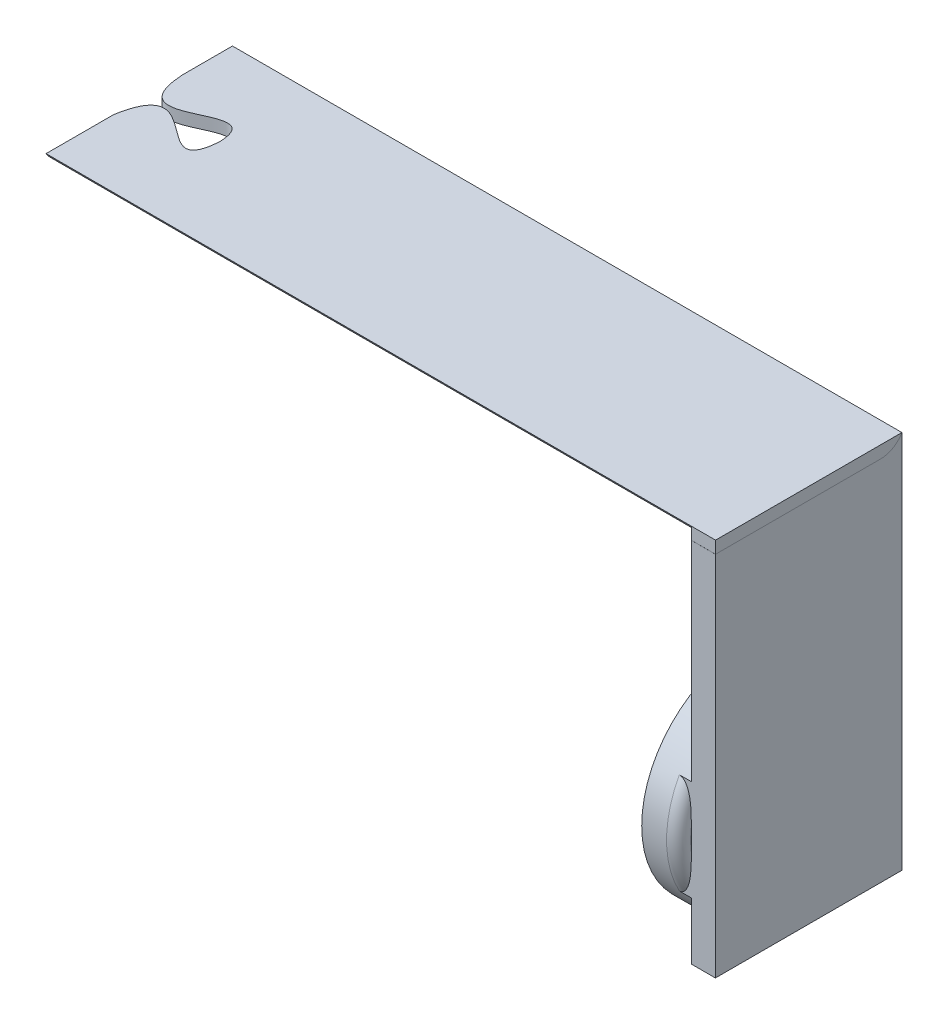
ISO-10303-21;
HEADER;
FILE_DESCRIPTION(('STEP AP214'),'2;1');
FILE_NAME('part.step','',(''),(''),'','','');
FILE_SCHEMA(('AUTOMOTIVE_DESIGN { 1 0 10303 214 1 1 1 1 }'));
ENDSEC;
DATA;
#1=APPLICATION_CONTEXT('core data for automotive mechanical design processes');
#2=APPLICATION_PROTOCOL_DEFINITION('international standard','automotive_design',2000,#1);
#3=PRODUCT_CONTEXT('',#1,'mechanical');
#4=PRODUCT('Part','Part','',(#3));
#5=PRODUCT_RELATED_PRODUCT_CATEGORY('part','',(#4));
#6=PRODUCT_DEFINITION_FORMATION('','',#4);
#7=PRODUCT_DEFINITION_CONTEXT('part definition',#1,'design');
#8=PRODUCT_DEFINITION('design','',#6,#7);
#9=PRODUCT_DEFINITION_SHAPE('','',#8);
#10=(LENGTH_UNIT() NAMED_UNIT(*) SI_UNIT(.MILLI.,.METRE.));
#11=(NAMED_UNIT(*) PLANE_ANGLE_UNIT() SI_UNIT($,.RADIAN.));
#12=(NAMED_UNIT(*) SI_UNIT($,.STERADIAN.) SOLID_ANGLE_UNIT());
#13=UNCERTAINTY_MEASURE_WITH_UNIT(LENGTH_MEASURE(1.E-05),#10,'distance_accuracy_value','');
#14=(GEOMETRIC_REPRESENTATION_CONTEXT(3) GLOBAL_UNCERTAINTY_ASSIGNED_CONTEXT((#13)) GLOBAL_UNIT_ASSIGNED_CONTEXT((#10,
#11,#12)) REPRESENTATION_CONTEXT('',''));
#15=CARTESIAN_POINT('',(0.,0.,0.));
#16=DIRECTION('',(0.,0.,1.));
#17=DIRECTION('',(1.,0.,0.));
#18=AXIS2_PLACEMENT_3D('',#15,#16,#17);
#19=CARTESIAN_POINT('',(8.64923186763945,0.,-18.2354736055888));
#20=DIRECTION('',(0.,1.,0.));
#21=DIRECTION('',(0.,0.,1.));
#22=AXIS2_PLACEMENT_3D('',#19,#20,#21);
#23=PLANE('',#22);
#24=DIRECTION('',(0.,0.,-1.));
#25=VECTOR('',#24,1.);
#26=CARTESIAN_POINT('',(133.981908671217,0.,-38.6842824654206));
#27=LINE('',#26,#25);
#28=CARTESIAN_POINT('',(133.981908671217,0.,-4.39940905122496));
#29=VERTEX_POINT('',#28);
#30=CARTESIAN_POINT('',(133.981908671217,0.,-34.2955617878023));
#31=VERTEX_POINT('',#30);
#32=EDGE_CURVE('E399',#29,#31,#27,.T.);
#33=ORIENTED_EDGE('',*,*,#32,.F.);
#34=DIRECTION('',(1.,0.,0.));
#35=VECTOR('',#34,1.);
#36=CARTESIAN_POINT('',(8.64923186763945,0.,-4.39940905122495));
#37=LINE('',#36,#35);
#38=CARTESIAN_POINT('',(0.,0.,-4.39940905122495));
#39=VERTEX_POINT('',#38);
#40=EDGE_CURVE('E48',#29,#39,#37,.F.);
#41=ORIENTED_EDGE('',*,*,#40,.T.);
#42=DIRECTION('',(0.,0.,1.));
#43=VECTOR('',#42,1.);
#44=CARTESIAN_POINT('',(0.,0.,0.));
#45=LINE('',#44,#43);
#46=CARTESIAN_POINT('',(0.,0.,-14.045240588338));
#47=VERTEX_POINT('',#46);
#48=EDGE_CURVE('E208',#47,#39,#45,.T.);
#49=ORIENTED_EDGE('',*,*,#48,.F.);
#50=CARTESIAN_POINT('',(15.8765522946349,0.,-19.9365647930575));
#51=CARTESIAN_POINT('',(14.6824579665654,0.,-5.67764296523862));
#52=CARTESIAN_POINT('',(3.08997624892814,0.,-31.6230181891996));
#53=CARTESIAN_POINT('',(0.,0.,-14.045240588338));
#54=B_SPLINE_CURVE_WITH_KNOTS('',3,(#50,#51,#52,#53),.UNSPECIFIED.,.F.,.F.,(4,4),(0.,1.),.UNSPECIFIED.);
#55=CARTESIAN_POINT('',(15.8765522946349,0.,-19.9365647930574));
#56=VERTEX_POINT('',#55);
#57=EDGE_CURVE('E213',#56,#47,#54,.T.);
#58=ORIENTED_EDGE('',*,*,#57,.F.);
#59=CARTESIAN_POINT('',(0.,0.,-28.2938483763786));
#60=CARTESIAN_POINT('',(1.00330627640816,0.,-11.158784678883));
#61=CARTESIAN_POINT('',(15.6582135386403,0.,-32.998799430672));
#62=CARTESIAN_POINT('',(15.8765522946349,0.,-19.9365647930574));
#63=B_SPLINE_CURVE_WITH_KNOTS('',3,(#59,#60,#61,#62),.UNSPECIFIED.,.F.,.F.,(4,4),(0.,1.),.UNSPECIFIED.);
#64=CARTESIAN_POINT('',(0.,0.,-28.2938483763786));
#65=VERTEX_POINT('',#64);
#66=EDGE_CURVE('E371',#65,#56,#63,.T.);
#67=ORIENTED_EDGE('',*,*,#66,.F.);
#68=DIRECTION('',(0.,0.,1.));
#69=VECTOR('',#68,1.);
#70=CARTESIAN_POINT('',(0.,0.,-28.2938483763786));
#71=LINE('',#70,#69);
#72=CARTESIAN_POINT('',(0.,0.,-34.2955617878023));
#73=VERTEX_POINT('',#72);
#74=EDGE_CURVE('E367',#73,#65,#71,.T.);
#75=ORIENTED_EDGE('',*,*,#74,.F.);
#76=DIRECTION('',(-1.,0.,0.));
#77=VECTOR('',#76,1.);
#78=CARTESIAN_POINT('',(8.64923186763945,0.,-34.2955617878023));
#79=LINE('',#78,#77);
#80=EDGE_CURVE('E326',#73,#31,#79,.F.);
#81=ORIENTED_EDGE('',*,*,#80,.T.);
#82=EDGE_LOOP('',(#33,#41,#49,#58,#67,#75,#81));
#83=FACE_BOUND('',#82,.T.);
#84=ADVANCED_FACE('F33',(#83),#23,.F.);
#85=CARTESIAN_POINT('',(133.981908671217,-76.2,-38.6842824654206));
#86=DIRECTION('',(1.,0.,0.));
#87=DIRECTION('',(0.,0.,-1.));
#88=AXIS2_PLACEMENT_3D('',#85,#86,#87);
#89=PLANE('',#88);
#90=CARTESIAN_POINT('',(133.981908671217,-53.848,-19.3474854195136));
#91=DIRECTION('',(-1.,0.,0.));
#92=DIRECTION('',(0.,0.,1.));
#93=AXIS2_PLACEMENT_3D('',#90,#91,#92);
#94=CIRCLE('',#93,22.);
#95=CARTESIAN_POINT('',(133.981908671217,-64.3402962217716,-38.6842824654206));
#96=VERTEX_POINT('',#95);
#97=CARTESIAN_POINT('',(133.981908671217,-64.3008038054558,0.01068837360663));
#98=VERTEX_POINT('',#97);
#99=EDGE_CURVE('E190',#96,#98,#94,.T.);
#100=ORIENTED_EDGE('',*,*,#99,.F.);
#101=DIRECTION('',(0.,1.,0.));
#102=VECTOR('',#101,1.);
#103=CARTESIAN_POINT('',(133.981908671217,-76.2,-38.6842824654206));
#104=LINE('',#103,#102);
#105=CARTESIAN_POINT('',(133.981908671217,-76.2,-38.6842824654206));
#106=VERTEX_POINT('',#105);
#107=EDGE_CURVE('E198',#106,#96,#104,.T.);
#108=ORIENTED_EDGE('',*,*,#107,.F.);
#109=DIRECTION('',(0.,0.,-1.));
#110=VECTOR('',#109,1.);
#111=CARTESIAN_POINT('',(133.981908671217,-76.2,-38.6842824654206));
#112=LINE('',#111,#110);
#113=CARTESIAN_POINT('',(133.981908671217,-76.2,0.0106883736066284));
#114=VERTEX_POINT('',#113);
#115=EDGE_CURVE('E429',#114,#106,#112,.T.);
#116=ORIENTED_EDGE('',*,*,#115,.F.);
#117=DIRECTION('',(0.,1.,0.));
#118=VECTOR('',#117,1.);
#119=CARTESIAN_POINT('',(133.981908671217,-76.2,0.0106883736066284));
#120=LINE('',#119,#118);
#121=EDGE_CURVE('E197',#114,#98,#120,.T.);
#122=ORIENTED_EDGE('',*,*,#121,.T.);
#123=EDGE_LOOP('',(#100,#108,#116,#122));
#124=FACE_BOUND('',#123,.T.);
#125=ADVANCED_FACE('F300',(#124),#89,.F.);
#126=DIRECTION('',(0.,0.,1.));
#127=VECTOR('',#126,1.);
#128=CARTESIAN_POINT('',(138.981908671217,0.,-38.6842824654206));
#129=LINE('',#128,#127);
#130=CARTESIAN_POINT('',(138.981908671217,0.,-34.2955617878023));
#131=VERTEX_POINT('',#130);
#132=CARTESIAN_POINT('',(138.981908671217,0.,0.));
#133=VERTEX_POINT('',#132);
#134=EDGE_CURVE('E435',#131,#133,#129,.T.);
#135=ORIENTED_EDGE('',*,*,#134,.F.);
#136=DIRECTION('',(-1.,0.,0.));
#137=VECTOR('',#136,1.);
#138=CARTESIAN_POINT('',(8.64923186763945,0.,-34.2955617878023));
#139=LINE('',#138,#137);
#140=CARTESIAN_POINT('',(139.,0.,-34.2955617878023));
#141=VERTEX_POINT('',#140);
#142=EDGE_CURVE('E324',#131,#141,#139,.F.);
#143=ORIENTED_EDGE('',*,*,#142,.T.);
#144=DIRECTION('',(0.,0.,-1.));
#145=VECTOR('',#144,1.);
#146=CARTESIAN_POINT('',(139.,0.,0.));
#147=LINE('',#146,#145);
#148=CARTESIAN_POINT('',(139.,0.,0.));
#149=VERTEX_POINT('',#148);
#150=EDGE_CURVE('E372',#149,#141,#147,.T.);
#151=ORIENTED_EDGE('',*,*,#150,.F.);
#152=DIRECTION('',(1.,0.,0.));
#153=VECTOR('',#152,1.);
#154=CARTESIAN_POINT('',(0.,0.,0.));
#155=LINE('',#154,#153);
#156=EDGE_CURVE('E448',#133,#149,#155,.T.);
#157=ORIENTED_EDGE('',*,*,#156,.F.);
#158=EDGE_LOOP('',(#135,#143,#151,#157));
#159=FACE_BOUND('',#158,.T.);
#160=ADVANCED_FACE('F261',(#159),#23,.F.);
#161=CARTESIAN_POINT('',(0.,2.54,0.));
#162=DIRECTION('',(1.,0.,0.));
#163=DIRECTION('',(0.,0.,-1.));
#164=AXIS2_PLACEMENT_3D('',#161,#162,#163);
#165=PLANE('',#164);
#166=ORIENTED_EDGE('',*,*,#48,.T.);
#167=CARTESIAN_POINT('',(0.,5.08,-4.39940905122495));
#168=DIRECTION('',(1.,0.,0.));
#169=DIRECTION('',(0.,0.,-1.));
#170=AXIS2_PLACEMENT_3D('',#167,#168,#169);
#171=CIRCLE('',#170,5.08);
#172=CARTESIAN_POINT('',(0.,2.54,0.));
#173=VERTEX_POINT('',#172);
#174=EDGE_CURVE('E41',#39,#173,#171,.F.);
#175=ORIENTED_EDGE('',*,*,#174,.T.);
#176=DIRECTION('',(0.,0.,1.));
#177=VECTOR('',#176,1.);
#178=CARTESIAN_POINT('',(0.,2.54,0.));
#179=LINE('',#178,#177);
#180=CARTESIAN_POINT('',(0.,2.54,-14.045240588338));
#181=VERTEX_POINT('',#180);
#182=EDGE_CURVE('E209',#181,#173,#179,.T.);
#183=ORIENTED_EDGE('',*,*,#182,.F.);
#184=DIRECTION('',(0.,-1.,0.));
#185=VECTOR('',#184,1.);
#186=CARTESIAN_POINT('',(0.,2.54,-14.045240588338));
#187=LINE('',#186,#185);
#188=EDGE_CURVE('E388',#181,#47,#187,.T.);
#189=ORIENTED_EDGE('',*,*,#188,.T.);
#190=EDGE_LOOP('',(#166,#175,#183,#189));
#191=FACE_BOUND('',#190,.T.);
#192=ADVANCED_FACE('F257',(#191),#165,.F.);
#193=CARTESIAN_POINT('',(0.,2.54,0.));
#194=DIRECTION('',(0.,0.,-1.));
#195=DIRECTION('',(-1.,0.,0.));
#196=AXIS2_PLACEMENT_3D('',#193,#194,#195);
#197=PLANE('',#196);
#198=DIRECTION('',(1.,0.,0.));
#199=VECTOR('',#198,1.);
#200=CARTESIAN_POINT('',(0.,2.54,0.));
#201=LINE('',#200,#199);
#202=CARTESIAN_POINT('',(133.981908671217,2.54,0.));
#203=VERTEX_POINT('',#202);
#204=CARTESIAN_POINT('',(139.,2.54,0.));
#205=VERTEX_POINT('',#204);
#206=EDGE_CURVE('E212',#203,#205,#201,.T.);
#207=ORIENTED_EDGE('',*,*,#206,.F.);
#208=DIRECTION('',(0.,-1.,0.));
#209=VECTOR('',#208,1.);
#210=CARTESIAN_POINT('',(133.981908671217,2.54,0.));
#211=LINE('',#210,#209);
#212=CARTESIAN_POINT('',(133.981908671217,0.,0.));
#213=VERTEX_POINT('',#212);
#214=EDGE_CURVE('E338',#203,#213,#211,.T.);
#215=ORIENTED_EDGE('',*,*,#214,.T.);
#216=EDGE_CURVE('E376',#213,#133,#155,.T.);
#217=ORIENTED_EDGE('',*,*,#216,.T.);
#218=ORIENTED_EDGE('',*,*,#156,.T.);
#219=DIRECTION('',(0.,-1.,0.));
#220=VECTOR('',#219,1.);
#221=CARTESIAN_POINT('',(139.,2.54,0.));
#222=LINE('',#221,#220);
#223=EDGE_CURVE('E355',#205,#149,#222,.T.);
#224=ORIENTED_EDGE('',*,*,#223,.F.);
#225=EDGE_LOOP('',(#207,#215,#217,#218,#224));
#226=FACE_BOUND('',#225,.T.);
#227=ADVANCED_FACE('F253',(#226),#197,.F.);
#228=CARTESIAN_POINT('',(139.,2.54,0.));
#229=DIRECTION('',(-1.,0.,0.));
#230=DIRECTION('',(0.,0.,1.));
#231=AXIS2_PLACEMENT_3D('',#228,#229,#230);
#232=PLANE('',#231);
#233=ORIENTED_EDGE('',*,*,#150,.T.);
#234=CARTESIAN_POINT('',(139.,5.08,-34.2955617878023));
#235=DIRECTION('',(-1.,0.,0.));
#236=DIRECTION('',(0.,0.,1.));
#237=AXIS2_PLACEMENT_3D('',#234,#235,#236);
#238=CIRCLE('',#237,5.08);
#239=CARTESIAN_POINT('',(139.,2.54,-38.6949708390272));
#240=VERTEX_POINT('',#239);
#241=EDGE_CURVE('E329',#141,#240,#238,.F.);
#242=ORIENTED_EDGE('',*,*,#241,.T.);
#243=DIRECTION('',(0.,0.,-1.));
#244=VECTOR('',#243,1.);
#245=CARTESIAN_POINT('',(139.,2.54,0.));
#246=LINE('',#245,#244);
#247=EDGE_CURVE('E217',#205,#240,#246,.T.);
#248=ORIENTED_EDGE('',*,*,#247,.F.);
#249=ORIENTED_EDGE('',*,*,#223,.T.);
#250=EDGE_LOOP('',(#233,#242,#248,#249));
#251=FACE_BOUND('',#250,.T.);
#252=ADVANCED_FACE('F249',(#251),#232,.F.);
#253=CARTESIAN_POINT('',(0.,2.54,-28.2938483763786));
#254=DIRECTION('',(1.,0.,0.));
#255=DIRECTION('',(0.,0.,-1.));
#256=AXIS2_PLACEMENT_3D('',#253,#254,#255);
#257=PLANE('',#256);
#258=DIRECTION('',(0.,0.,1.));
#259=VECTOR('',#258,1.);
#260=CARTESIAN_POINT('',(0.,2.54,-28.2938483763786));
#261=LINE('',#260,#259);
#262=CARTESIAN_POINT('',(0.,2.54,-38.6949708390272));
#263=VERTEX_POINT('',#262);
#264=CARTESIAN_POINT('',(0.,2.54,-28.2938483763786));
#265=VERTEX_POINT('',#264);
#266=EDGE_CURVE('E223',#263,#265,#261,.T.);
#267=ORIENTED_EDGE('',*,*,#266,.F.);
#268=CARTESIAN_POINT('',(0.,5.08,-34.2955617878023));
#269=DIRECTION('',(1.,0.,0.));
#270=DIRECTION('',(0.,0.,-1.));
#271=AXIS2_PLACEMENT_3D('',#268,#269,#270);
#272=CIRCLE('',#271,5.08);
#273=EDGE_CURVE('E322',#263,#73,#272,.F.);
#274=ORIENTED_EDGE('',*,*,#273,.T.);
#275=ORIENTED_EDGE('',*,*,#74,.T.);
#276=DIRECTION('',(0.,-1.,0.));
#277=VECTOR('',#276,1.);
#278=CARTESIAN_POINT('',(0.,2.54,-28.2938483763786));
#279=LINE('',#278,#277);
#280=EDGE_CURVE('E396',#265,#65,#279,.T.);
#281=ORIENTED_EDGE('',*,*,#280,.F.);
#282=EDGE_LOOP('',(#267,#274,#275,#281));
#283=FACE_BOUND('',#282,.T.);
#284=ADVANCED_FACE('F244',(#283),#257,.F.);
#285=CARTESIAN_POINT('',(0.,2.54,-28.2938483763786));
#286=CARTESIAN_POINT('',(1.00330627640816,2.54,-11.158784678883));
#287=CARTESIAN_POINT('',(15.6582135386403,2.54,-32.998799430672));
#288=CARTESIAN_POINT('',(15.8765522946349,2.54,-19.9365647930574));
#289=B_SPLINE_CURVE_WITH_KNOTS('',3,(#285,#286,#287,#288),.UNSPECIFIED.,.F.,.F.,(4,4),(0.,1.),.UNSPECIFIED.);
#290=DIRECTION('',(0.,-1.,0.));
#291=VECTOR('',#290,1.);
#292=SURFACE_OF_LINEAR_EXTRUSION('',#289,#291);
#293=ORIENTED_EDGE('',*,*,#66,.T.);
#294=DIRECTION('',(0.,-1.,0.));
#295=VECTOR('',#294,1.);
#296=CARTESIAN_POINT('',(15.8765522946349,2.54,-19.9365647930574));
#297=LINE('',#296,#295);
#298=CARTESIAN_POINT('',(15.8765522946349,2.54,-19.9365647930574));
#299=VERTEX_POINT('',#298);
#300=EDGE_CURVE('E393',#299,#56,#297,.T.);
#301=ORIENTED_EDGE('',*,*,#300,.F.);
#302=EDGE_CURVE('E225',#265,#299,#289,.T.);
#303=ORIENTED_EDGE('',*,*,#302,.F.);
#304=ORIENTED_EDGE('',*,*,#280,.T.);
#305=EDGE_LOOP('',(#293,#301,#303,#304));
#306=FACE_BOUND('',#305,.T.);
#307=ADVANCED_FACE('F239',(#306),#292,.F.);
#308=CARTESIAN_POINT('',(15.8765522946349,2.54,-19.9365647930575));
#309=CARTESIAN_POINT('',(14.6824579665654,2.54,-5.67764296523862));
#310=CARTESIAN_POINT('',(3.08997624892814,2.54,-31.6230181891996));
#311=CARTESIAN_POINT('',(0.,2.54,-14.045240588338));
#312=B_SPLINE_CURVE_WITH_KNOTS('',3,(#308,#309,#310,#311),.UNSPECIFIED.,.F.,.F.,(4,4),(0.,1.),.UNSPECIFIED.);
#313=DIRECTION('',(0.,-1.,0.));
#314=VECTOR('',#313,1.);
#315=SURFACE_OF_LINEAR_EXTRUSION('',#312,#314);
#316=ORIENTED_EDGE('',*,*,#57,.T.);
#317=ORIENTED_EDGE('',*,*,#188,.F.);
#318=EDGE_CURVE('E230',#299,#181,#312,.T.);
#319=ORIENTED_EDGE('',*,*,#318,.F.);
#320=ORIENTED_EDGE('',*,*,#300,.T.);
#321=EDGE_LOOP('',(#316,#317,#319,#320));
#322=FACE_BOUND('',#321,.T.);
#323=ADVANCED_FACE('F243',(#322),#315,.F.);
#324=CARTESIAN_POINT('',(8.64923186763945,2.54,-18.2354736055888));
#325=DIRECTION('',(0.,1.,0.));
#326=DIRECTION('',(0.,0.,1.));
#327=AXIS2_PLACEMENT_3D('',#324,#325,#326);
#328=PLANE('',#327);
#329=ORIENTED_EDGE('',*,*,#182,.T.);
#330=EDGE_CURVE('E214',#173,#203,#201,.T.);
#331=ORIENTED_EDGE('',*,*,#330,.T.);
#332=ORIENTED_EDGE('',*,*,#206,.T.);
#333=ORIENTED_EDGE('',*,*,#247,.T.);
#334=DIRECTION('',(-1.,0.,0.));
#335=VECTOR('',#334,1.);
#336=CARTESIAN_POINT('',(0.,2.54,-38.6949708390272));
#337=LINE('',#336,#335);
#338=EDGE_CURVE('E220',#240,#263,#337,.T.);
#339=ORIENTED_EDGE('',*,*,#338,.T.);
#340=ORIENTED_EDGE('',*,*,#266,.T.);
#341=ORIENTED_EDGE('',*,*,#302,.T.);
#342=ORIENTED_EDGE('',*,*,#318,.T.);
#343=EDGE_LOOP('',(#329,#331,#332,#333,#339,#340,#341,#342));
#344=FACE_BOUND('',#343,.T.);
#345=ADVANCED_FACE('F346',(#344),#328,.T.);
#346=CARTESIAN_POINT('',(138.981908671217,-76.2,-38.6842824654206));
#347=DIRECTION('',(-1.,0.,0.));
#348=DIRECTION('',(0.,0.,1.));
#349=AXIS2_PLACEMENT_3D('',#346,#347,#348);
#350=PLANE('',#349);
#351=DIRECTION('',(0.,1.,0.));
#352=VECTOR('',#351,1.);
#353=CARTESIAN_POINT('',(138.981908671217,-76.2,-38.6842824654206));
#354=LINE('',#353,#352);
#355=CARTESIAN_POINT('',(138.981908671217,-76.2,-38.6842824654206));
#356=VERTEX_POINT('',#355);
#357=CARTESIAN_POINT('',(138.981908671217,2.52157649834013,-38.6842824654206));
#358=VERTEX_POINT('',#357);
#359=EDGE_CURVE('E425',#356,#358,#354,.T.);
#360=ORIENTED_EDGE('',*,*,#359,.T.);
#361=CARTESIAN_POINT('',(138.981908671217,5.08,-34.2955617878023));
#362=DIRECTION('',(-1.,0.,0.));
#363=DIRECTION('',(0.,0.,1.));
#364=AXIS2_PLACEMENT_3D('',#361,#362,#363);
#365=CIRCLE('',#364,5.08);
#366=EDGE_CURVE('E336',#358,#131,#365,.T.);
#367=ORIENTED_EDGE('',*,*,#366,.T.);
#368=ORIENTED_EDGE('',*,*,#134,.T.);
#369=CARTESIAN_POINT('',(138.981908671217,0.,0.010688373606629));
#370=VERTEX_POINT('',#369);
#371=EDGE_CURVE('E437',#133,#370,#129,.T.);
#372=ORIENTED_EDGE('',*,*,#371,.T.);
#373=DIRECTION('',(0.,1.,0.));
#374=VECTOR('',#373,1.);
#375=CARTESIAN_POINT('',(138.981908671217,-76.2,0.010688373606629));
#376=LINE('',#375,#374);
#377=CARTESIAN_POINT('',(138.981908671217,-76.2,0.010688373606629));
#378=VERTEX_POINT('',#377);
#379=EDGE_CURVE('E201',#378,#370,#376,.T.);
#380=ORIENTED_EDGE('',*,*,#379,.F.);
#381=DIRECTION('',(0.,0.,1.));
#382=VECTOR('',#381,1.);
#383=CARTESIAN_POINT('',(138.981908671217,-76.2,-38.6842824654206));
#384=LINE('',#383,#382);
#385=EDGE_CURVE('E439',#356,#378,#384,.T.);
#386=ORIENTED_EDGE('',*,*,#385,.F.);
#387=EDGE_LOOP('',(#360,#367,#368,#372,#380,#386));
#388=FACE_BOUND('',#387,.T.);
#389=ADVANCED_FACE('F304',(#388),#350,.F.);
#390=CARTESIAN_POINT('',(138.981908671217,-76.2,0.010688373606629));
#391=DIRECTION('',(0.,0.,-1.));
#392=DIRECTION('',(-1.,0.,0.));
#393=AXIS2_PLACEMENT_3D('',#390,#391,#392);
#394=PLANE('',#393);
#395=DIRECTION('',(-1.,0.,0.));
#396=VECTOR('',#395,1.);
#397=CARTESIAN_POINT('',(138.981908671217,0.,0.010688373606629));
#398=LINE('',#397,#396);
#399=CARTESIAN_POINT('',(133.981908671217,0.,0.0106883736066284));
#400=VERTEX_POINT('',#399);
#401=EDGE_CURVE('E195',#370,#400,#398,.T.);
#402=ORIENTED_EDGE('',*,*,#401,.T.);
#403=CARTESIAN_POINT('',(133.981908671217,-43.3951961945441,0.01068837360663));
#404=VERTEX_POINT('',#403);
#405=EDGE_CURVE('E185',#404,#400,#120,.T.);
#406=ORIENTED_EDGE('',*,*,#405,.F.);
#407=DIRECTION('',(1.,0.,0.));
#408=VECTOR('',#407,1.);
#409=CARTESIAN_POINT('',(131.481908671217,-43.3951961945441,0.0106883736066281));
#410=LINE('',#409,#408);
#411=CARTESIAN_POINT('',(131.481908671217,-43.3951961945441,0.0106883736066281));
#412=VERTEX_POINT('',#411);
#413=EDGE_CURVE('E170',#412,#404,#410,.T.);
#414=ORIENTED_EDGE('',*,*,#413,.F.);
#415=CARTESIAN_POINT('',(131.481908671217,-43.3951961945441,0.0106883736066281));
#416=CARTESIAN_POINT('',(131.517720355948,-43.395188155444,0.0106883736066281));
#417=CARTESIAN_POINT('',(131.553511819631,-43.3968171069313,0.0106883736066281));
#418=CARTESIAN_POINT('',(131.624777186174,-43.4032626875032,0.0106883736066281));
#419=CARTESIAN_POINT('',(131.660251330287,-43.4080766408066,0.0106883736066281));
#420=CARTESIAN_POINT('',(131.765198343257,-43.4270489773248,0.0106883736066281));
#421=CARTESIAN_POINT('',(131.833890942065,-43.4457415019394,0.0106883736066281));
#422=CARTESIAN_POINT('',(131.967155095708,-43.4936407228407,0.0106883736066281));
#423=CARTESIAN_POINT('',(132.031738533081,-43.5228153137316,0.0106883736066282));
#424=CARTESIAN_POINT('',(132.156352793604,-43.5898445892212,0.0106883736066282));
#425=CARTESIAN_POINT('',(132.216372243573,-43.6277200695228,0.0106883736066282));
#426=CARTESIAN_POINT('',(132.371614104055,-43.7391249722142,0.0106883736066282));
#427=CARTESIAN_POINT('',(132.462199505101,-43.8190994637775,0.0106883736066282));
#428=CARTESIAN_POINT('',(132.630084110199,-43.9919212519078,0.0106883736066282));
#429=CARTESIAN_POINT('',(132.707345561836,-44.0848038219689,0.0106883736066282));
#430=CARTESIAN_POINT('',(132.842390140228,-44.2682522511272,0.0106883736066282));
#431=CARTESIAN_POINT('',(132.901381582368,-44.3579449218048,0.0106883736066283));
#432=CARTESIAN_POINT('',(133.011493142527,-44.5420855737969,0.0106883736066283));
#433=CARTESIAN_POINT('',(133.062606576622,-44.6365375038384,0.0106883736066283));
#434=CARTESIAN_POINT('',(133.158091931585,-44.8289505188739,0.0106883736066283));
#435=CARTESIAN_POINT('',(133.202452429907,-44.9269172107501,0.0106883736066283));
#436=CARTESIAN_POINT('',(133.285243201985,-45.1252593119089,0.0106883736066283));
#437=CARTESIAN_POINT('',(133.323675553314,-45.2256338630199,0.0106883736066283));
#438=CARTESIAN_POINT('',(133.411139046982,-45.4725794741439,0.0106883736066283));
#439=CARTESIAN_POINT('',(133.457433369633,-45.6201173589704,0.0106883736066283));
#440=CARTESIAN_POINT('',(133.541302952854,-45.9176787026414,0.0106883736066283));
#441=CARTESIAN_POINT('',(133.578873862368,-46.06770336204,0.0106883736066283));
#442=CARTESIAN_POINT('',(133.646796969584,-46.3696312293421,0.0106883736066283));
#443=CARTESIAN_POINT('',(133.677136574026,-46.5215372367276,0.0106883736066284));
#444=CARTESIAN_POINT('',(133.73171111904,-46.8264543647306,0.0106883736066284));
#445=CARTESIAN_POINT('',(133.7559449284,-46.9794656847342,0.0106883736066284));
#446=CARTESIAN_POINT('',(133.799416467178,-47.2871105725718,0.0106883736066284));
#447=CARTESIAN_POINT('',(133.818623777572,-47.4417483818706,0.0106883736066284));
#448=CARTESIAN_POINT('',(133.85269487994,-47.7515064266056,0.0106883736066284));
#449=CARTESIAN_POINT('',(133.867558281744,-47.9066267041135,0.0106883736066284));
#450=CARTESIAN_POINT('',(133.906749890725,-48.3725063331307,0.0106883736066284));
#451=CARTESIAN_POINT('',(133.925671330688,-48.6837221302626,0.0106883736066284));
#452=CARTESIAN_POINT('',(133.944498611049,-49.1001788378973,0.0106883736066284));
#453=CARTESIAN_POINT('',(133.94869711845,-49.2052689168414,0.0106883736066284));
#454=CARTESIAN_POINT('',(133.956132895303,-49.4154691829037,0.0106883736066284));
#455=CARTESIAN_POINT('',(133.959370312132,-49.520579364463,0.0106883736066284));
#456=CARTESIAN_POINT('',(133.967860933465,-49.8359910775012,0.0106883736066284));
#457=CARTESIAN_POINT('',(133.971890427967,-50.0463247584597,0.0106883736066284));
#458=CARTESIAN_POINT('',(133.977653718493,-50.4639778513131,0.0106883736066284));
#459=CARTESIAN_POINT('',(133.979419857493,-50.671296885019,0.0106883736066284));
#460=CARTESIAN_POINT('',(133.981534288654,-51.0858872456687,0.0106883736066284));
#461=CARTESIAN_POINT('',(133.981882962396,-51.2931585704298,0.0106883736066284));
#462=CARTESIAN_POINT('',(133.981908671217,-51.500425209849,0.0106883736066284));
#463=B_SPLINE_CURVE_WITH_KNOTS('',3,(#415,#416,#417,#418,#419,#420,#421,#422,#423,#424,#425,
#426,#427,#428,#429,#430,#431,#432,#433,#434,#435,#436,#437,#438,#439,#440,#441,#442,#443,#444,
#445,#446,#447,#448,#449,#450,#451,#452,#453,#454,#455,#456,#457,#458,#459,#460,#461,#462),
.UNSPECIFIED.,.F.,.F.,(4,2,2,2,2,2,2,2,2,2,2,2,2,2,2,2,2,2,2,2,2,2,2,4),(0.,0.107360168767651,
0.214630256529774,0.42711447878257,0.638953357492726,0.851303912171125,1.21173062132837,
1.5731623669562,1.89475397689027,2.21661694979968,2.53901844282665,2.86130668935475,
3.32484201406878,3.7886080462239,4.25317591666245,4.71782979371933,5.18523379921942,
5.65267977419662,6.58776016917273,6.90328350004298,7.21875842224722,7.84985543562116,
8.47182976648564,9.09363665119898),.UNSPECIFIED.);
#464=CARTESIAN_POINT('',(133.981908671217,-51.500425209849,0.01068837360663));
#465=VERTEX_POINT('',#464);
#466=EDGE_CURVE('E308',#412,#465,#463,.T.);
#467=ORIENTED_EDGE('',*,*,#466,.T.);
#468=DIRECTION('',(0.,1.,0.));
#469=VECTOR('',#468,1.);
#470=CARTESIAN_POINT('',(133.981908671217,-76.2,0.0106883736066284));
#471=LINE('',#470,#469);
#472=CARTESIAN_POINT('',(133.981908671217,-56.195574790151,0.01068837360663));
#473=VERTEX_POINT('',#472);
#474=EDGE_CURVE('E452',#473,#465,#471,.T.);
#475=ORIENTED_EDGE('',*,*,#474,.F.);
#476=CARTESIAN_POINT('',(133.981908671217,-56.195574790151,0.0106883736066284));
#477=CARTESIAN_POINT('',(133.981882102657,-56.40402255698,0.0106883736066284));
#478=CARTESIAN_POINT('',(133.98152986498,-56.6124756050989,0.0106883736066284));
#479=CARTESIAN_POINT('',(133.979387860439,-57.0294085689302,0.0106883736066284));
#480=CARTESIAN_POINT('',(133.977597851143,-57.2378884832446,0.0106883736066284));
#481=CARTESIAN_POINT('',(133.971778382489,-57.6559136235971,0.0106883736066284));
#482=CARTESIAN_POINT('',(133.967737236515,-57.8654587069826,0.0106883736066284));
#483=CARTESIAN_POINT('',(133.956411707109,-58.2844534316217,0.0106883736066284));
#484=CARTESIAN_POINT('',(133.949127528406,-58.4939030780647,0.0106883736066284));
#485=CARTESIAN_POINT('',(133.93016694758,-58.9123565195681,0.0106883736066284));
#486=CARTESIAN_POINT('',(133.918495902122,-59.1213605470083,0.0106883736066284));
#487=CARTESIAN_POINT('',(133.889393833821,-59.53896376474,0.0106883736066284));
#488=CARTESIAN_POINT('',(133.871963319684,-59.7475629891496,0.0106883736066284));
#489=CARTESIAN_POINT('',(133.829749080918,-60.1635989979158,0.0106883736066284));
#490=CARTESIAN_POINT('',(133.804980571038,-60.3710372914082,0.0106883736066284));
#491=CARTESIAN_POINT('',(133.746100932188,-60.7845622131194,0.0106883736066284));
#492=CARTESIAN_POINT('',(133.711993065095,-60.9906492875824,0.0106883736066284));
#493=CARTESIAN_POINT('',(133.653266311207,-61.2912284781848,0.0106883736066283));
#494=CARTESIAN_POINT('',(133.633285569485,-61.386629086399,0.0106883736066283));
#495=CARTESIAN_POINT('',(133.590415183651,-61.5767844954152,0.0106883736066283));
#496=CARTESIAN_POINT('',(133.567525099483,-61.6715391962305,0.0106883736066283));
#497=CARTESIAN_POINT('',(133.493717736638,-61.9555953552323,0.0106883736066283));
#498=CARTESIAN_POINT('',(133.437852685513,-62.1436791459144,0.0106883736066283));
#499=CARTESIAN_POINT('',(133.330502262212,-62.4532771175496,0.0106883736066283));
#500=CARTESIAN_POINT('',(133.283598339658,-62.5763775877592,0.0106883736066283));
#501=CARTESIAN_POINT('',(133.180751191768,-62.8189364745895,0.0106883736066283));
#502=CARTESIAN_POINT('',(133.124800163311,-62.9383916404554,0.0106883736066283));
#503=CARTESIAN_POINT('',(133.002593035616,-63.1708160055116,0.0106883736066283));
#504=CARTESIAN_POINT('',(132.936419255508,-63.2838279195219,0.0106883736066283));
#505=CARTESIAN_POINT('',(132.791434557769,-63.5013074831703,0.0106883736066282));
#506=CARTESIAN_POINT('',(132.712653909411,-63.6057947155113,0.0106883736066282));
#507=CARTESIAN_POINT('',(132.567245411085,-63.7708009682716,0.0106883736066282));
#508=CARTESIAN_POINT('',(132.504600815202,-63.8348055087118,0.0106883736066282));
#509=CARTESIAN_POINT('',(132.371499339962,-63.9544087280094,0.0106883736066282));
#510=CARTESIAN_POINT('',(132.301035423542,-64.0099997269344,0.0106883736066282));
#511=CARTESIAN_POINT('',(132.15118960543,-64.1102143792808,0.0106883736066282));
#512=CARTESIAN_POINT('',(132.071702103941,-64.1546832955283,0.0106883736066282));
#513=CARTESIAN_POINT('',(131.905757484498,-64.2275104654632,0.0106883736066281));
#514=CARTESIAN_POINT('',(131.819330106512,-64.2559336706213,0.0106883736066281));
#515=CARTESIAN_POINT('',(131.690067309222,-64.2832433106801,0.0106883736066281));
#516=CARTESIAN_POINT('',(131.648771569784,-64.2897940983976,0.0106883736066281));
#517=CARTESIAN_POINT('',(131.56563270556,-64.2985857644586,0.0106883736066281));
#518=CARTESIAN_POINT('',(131.52378856685,-64.3008170156723,0.0106883736066281));
#519=CARTESIAN_POINT('',(131.481908671217,-64.3008038054559,0.0106883736066281));
#520=B_SPLINE_CURVE_WITH_KNOTS('',3,(#476,#477,#478,#479,#480,#481,#482,#483,#484,#485,#486,
#487,#488,#489,#490,#491,#492,#493,#494,#495,#496,#497,#498,#499,#500,#501,#502,#503,#504,#505,
#506,#507,#508,#509,#510,#511,#512,#513,#514,#515,#516,#517,#518,#519),.UNSPECIFIED.,.F.,.F.,(4,
2,2,2,2,2,2,2,2,2,2,2,2,2,2,2,2,2,2,2,2,4),(0.,0.625351399658803,1.2508082657591,
1.87954282066756,2.50823768992278,3.13616736053618,3.76404158399168,4.39062296434293,
5.01698578246291,5.30935502323321,5.60176853943402,6.18967245720286,6.58460186152906,
6.97987372711534,7.37211429308158,7.76342683701538,8.03153467012415,8.29988577654118,
8.57178520343307,8.84257596758604,8.96781149101034,9.09332581214592),.UNSPECIFIED.);
#521=CARTESIAN_POINT('',(131.481908671217,-64.3008038054558,0.0106883736066311));
#522=VERTEX_POINT('',#521);
#523=EDGE_CURVE('E314',#473,#522,#520,.T.);
#524=ORIENTED_EDGE('',*,*,#523,.T.);
#525=DIRECTION('',(1.,0.,0.));
#526=VECTOR('',#525,1.);
#527=CARTESIAN_POINT('',(133.981908671217,-64.3008038054558,0.01068837360663));
#528=LINE('',#527,#526);
#529=EDGE_CURVE('E286',#98,#522,#528,.F.);
#530=ORIENTED_EDGE('',*,*,#529,.F.);
#531=ORIENTED_EDGE('',*,*,#121,.F.);
#532=DIRECTION('',(-1.,0.,0.));
#533=VECTOR('',#532,1.);
#534=CARTESIAN_POINT('',(138.981908671217,-76.2,0.010688373606629));
#535=LINE('',#534,#533);
#536=EDGE_CURVE('E431',#378,#114,#535,.T.);
#537=ORIENTED_EDGE('',*,*,#536,.F.);
#538=ORIENTED_EDGE('',*,*,#379,.T.);
#539=EDGE_LOOP('',(#402,#406,#414,#467,#475,#524,#530,#531,#537,#538));
#540=FACE_BOUND('',#539,.T.);
#541=ADVANCED_FACE('F192',(#540),#394,.F.);
#542=CARTESIAN_POINT('',(133.981908671217,-43.3557037782284,-38.6842824654206));
#543=VERTEX_POINT('',#542);
#544=EDGE_CURVE('E174',#404,#543,#94,.T.);
#545=ORIENTED_EDGE('',*,*,#544,.F.);
#546=ORIENTED_EDGE('',*,*,#405,.T.);
#547=EDGE_CURVE('E350',#400,#213,#27,.T.);
#548=ORIENTED_EDGE('',*,*,#547,.T.);
#549=ORIENTED_EDGE('',*,*,#214,.F.);
#550=CARTESIAN_POINT('',(133.981908671217,5.08,-4.39940905122495));
#551=DIRECTION('',(1.,0.,0.));
#552=DIRECTION('',(0.,0.,-1.));
#553=AXIS2_PLACEMENT_3D('',#550,#551,#552);
#554=CIRCLE('',#553,5.08);
#555=EDGE_CURVE('E11',#203,#29,#554,.T.);
#556=ORIENTED_EDGE('',*,*,#555,.T.);
#557=ORIENTED_EDGE('',*,*,#32,.T.);
#558=CARTESIAN_POINT('',(133.981908671217,5.08,-34.2955617878023));
#559=DIRECTION('',(1.,0.,0.));
#560=DIRECTION('',(0.,0.,-1.));
#561=AXIS2_PLACEMENT_3D('',#558,#559,#560);
#562=CIRCLE('',#561,5.08);
#563=CARTESIAN_POINT('',(133.981908671217,2.52157649834013,-38.6842824654206));
#564=VERTEX_POINT('',#563);
#565=EDGE_CURVE('E331',#31,#564,#562,.T.);
#566=ORIENTED_EDGE('',*,*,#565,.T.);
#567=EDGE_CURVE('E188',#543,#564,#104,.T.);
#568=ORIENTED_EDGE('',*,*,#567,.F.);
#569=EDGE_LOOP('',(#545,#546,#548,#549,#556,#557,#566,#568));
#570=FACE_BOUND('',#569,.T.);
#571=ADVANCED_FACE('F183',(#570),#89,.F.);
#572=CARTESIAN_POINT('',(138.981908671217,-76.2,-38.6842824654206));
#573=DIRECTION('',(0.,0.,1.));
#574=DIRECTION('',(1.,0.,0.));
#575=AXIS2_PLACEMENT_3D('',#572,#573,#574);
#576=PLANE('',#575);
#577=ORIENTED_EDGE('',*,*,#567,.T.);
#578=DIRECTION('',(-1.,0.,0.));
#579=VECTOR('',#578,1.);
#580=CARTESIAN_POINT('',(133.981908671217,2.52157649834016,-38.6842824654206));
#581=LINE('',#580,#579);
#582=EDGE_CURVE('E333',#564,#358,#581,.F.);
#583=ORIENTED_EDGE('',*,*,#582,.T.);
#584=ORIENTED_EDGE('',*,*,#359,.F.);
#585=DIRECTION('',(1.,0.,0.));
#586=VECTOR('',#585,1.);
#587=CARTESIAN_POINT('',(138.981908671217,-76.2,-38.6842824654206));
#588=LINE('',#587,#586);
#589=EDGE_CURVE('E424',#106,#356,#588,.T.);
#590=ORIENTED_EDGE('',*,*,#589,.F.);
#591=ORIENTED_EDGE('',*,*,#107,.T.);
#592=DIRECTION('',(1.,0.,0.));
#593=VECTOR('',#592,1.);
#594=CARTESIAN_POINT('',(131.481908671217,-64.3402962217716,-38.6842824654206));
#595=LINE('',#594,#593);
#596=CARTESIAN_POINT('',(131.481908671217,-64.3402962217716,-38.6842824654206));
#597=VERTEX_POINT('',#596);
#598=EDGE_CURVE('E405',#597,#96,#595,.T.);
#599=ORIENTED_EDGE('',*,*,#598,.F.);
#600=CARTESIAN_POINT('',(131.481908671217,-64.3402962217716,-38.6842824654206));
#601=CARTESIAN_POINT('',(131.517841041878,-64.340304259003,-38.6842824654206));
#602=CARTESIAN_POINT('',(131.553753143558,-64.3386705089515,-38.6842824654206));
#603=CARTESIAN_POINT('',(131.625259033927,-64.3322057738294,-38.6842824654206));
#604=CARTESIAN_POINT('',(131.660853063714,-64.3273774638587,-38.6842824654206));
#605=CARTESIAN_POINT('',(131.766156855284,-64.3083478700274,-38.6842824654206));
#606=CARTESIAN_POINT('',(131.835084252345,-64.2895982637023,-38.6842824654206));
#607=CARTESIAN_POINT('',(131.96880603387,-64.241548851818,-38.6842824654206));
#608=CARTESIAN_POINT('',(132.033612297425,-64.2122811535834,-38.6842824654206));
#609=CARTESIAN_POINT('',(132.15865558463,-64.1450333186122,-38.6842824654206));
#610=CARTESIAN_POINT('',(132.218881228547,-64.1070323698796,-38.6842824654206));
#611=CARTESIAN_POINT('',(132.374555471428,-63.9953210447522,-38.6842824654206));
#612=CARTESIAN_POINT('',(132.465362578053,-63.9151589547279,-38.6842824654206));
#613=CARTESIAN_POINT('',(132.633653468675,-63.7419247577164,-38.6842824654206));
#614=CARTESIAN_POINT('',(132.711099424056,-63.648817301107,-38.6842824654206));
#615=CARTESIAN_POINT('',(132.846361126061,-63.4650442493111,-38.6842824654206));
#616=CARTESIAN_POINT('',(132.905402882435,-63.3752644576881,-38.6842824654206));
#617=CARTESIAN_POINT('',(133.015605267672,-63.1909444091878,-38.6842824654206));
#618=CARTESIAN_POINT('',(133.066759227359,-63.0964002126121,-38.6842824654206));
#619=CARTESIAN_POINT('',(133.162313346618,-62.9037972923634,-38.6842824654206));
#620=CARTESIAN_POINT('',(133.206702061285,-62.8057329522989,-38.6842824654206));
#621=CARTESIAN_POINT('',(133.289535909,-62.6071909153708,-38.6842824654206));
#622=CARTESIAN_POINT('',(133.327983108644,-62.5067140717444,-38.6842824654206));
#623=CARTESIAN_POINT('',(133.415288957408,-62.2600147942524,-38.6842824654206));
#624=CARTESIAN_POINT('',(133.461439721746,-62.1128365593469,-38.6842824654206));
#625=CARTESIAN_POINT('',(133.545048954459,-61.8160028800995,-38.6842824654206));
#626=CARTESIAN_POINT('',(133.582503060222,-61.6663462326339,-38.6842824654206));
#627=CARTESIAN_POINT('',(133.650207368267,-61.3651615028343,-38.6842824654206));
#628=CARTESIAN_POINT('',(133.680445093113,-61.2136306488337,-38.6842824654206));
#629=CARTESIAN_POINT('',(133.734823822075,-60.9094663545789,-38.6842824654206));
#630=CARTESIAN_POINT('',(133.758963693545,-60.7568327148953,-38.6842824654206));
#631=CARTESIAN_POINT('',(133.802259497714,-60.4498764102359,-38.6842824654206));
#632=CARTESIAN_POINT('',(133.821382642568,-60.295549182517,-38.6842824654206));
#633=CARTESIAN_POINT('',(133.85528079426,-59.9864130252055,-38.6842824654206));
#634=CARTESIAN_POINT('',(133.870055416207,-59.8316040541981,-38.6842824654206));
#635=CARTESIAN_POINT('',(133.908939526396,-59.3670479126835,-38.6842824654206));
#636=CARTESIAN_POINT('',(133.927651294385,-59.0568500413098,-38.6842824654206));
#637=CARTESIAN_POINT('',(133.95042857616,-58.546848465727,-38.6842824654206));
#638=CARTESIAN_POINT('',(133.957337784811,-58.3471493535082,-38.6842824654206));
#639=CARTESIAN_POINT('',(133.968140035371,-57.9476370541816,-38.6842824654206));
#640=CARTESIAN_POINT('',(133.972032615882,-57.7478238542994,-38.6842824654206));
#641=CARTESIAN_POINT('',(133.977648044161,-57.3509201388213,-38.6842824654206));
#642=CARTESIAN_POINT('',(133.97939999085,-57.1538299648917,-38.6842824654206));
#643=CARTESIAN_POINT('',(133.981519767821,-56.7596899175365,-38.6842824654206));
#644=CARTESIAN_POINT('',(133.981887938935,-56.5626400461424,-38.6842824654206));
#645=CARTESIAN_POINT('',(133.981908671217,-56.3655940906752,-38.6842824654206));
#646=B_SPLINE_CURVE_WITH_KNOTS('',3,(#600,#601,#602,#603,#604,#605,#606,#607,#608,#609,#610,
#611,#612,#613,#614,#615,#616,#617,#618,#619,#620,#621,#622,#623,#624,#625,#626,#627,#628,#629,
#630,#631,#632,#633,#634,#635,#636,#637,#638,#639,#640,#641,#642,#643,#644,#645),.UNSPECIFIED.,
.F.,.F.,(4,2,2,2,2,2,2,2,2,2,2,2,2,2,2,2,2,2,2,2,2,2,4),(0.,0.107722036872719,0.215353982115663,
0.428559580810431,0.641119804680704,0.854191926935058,1.21548508287212,1.57778493247767,
1.89967775231607,2.22184125933852,2.54454386781356,2.86713397901438,3.32951290153591,
3.79212327421703,4.25552781736552,4.71901837247379,5.18546667336437,5.65195624761796,
6.58396386136569,7.18340507099987,7.7829379481323,8.37422694717309,8.96537029837723),.UNSPECIFIED.);
#647=CARTESIAN_POINT('',(133.981908671217,-56.3655940906752,-38.6842824654206));
#648=VERTEX_POINT('',#647);
#649=EDGE_CURVE('E274',#597,#648,#646,.T.);
#650=ORIENTED_EDGE('',*,*,#649,.T.);
#651=CARTESIAN_POINT('',(133.981908671217,-51.3304059093248,-38.6842824654206));
#652=VERTEX_POINT('',#651);
#653=EDGE_CURVE('E203',#648,#652,#104,.T.);
#654=ORIENTED_EDGE('',*,*,#653,.T.);
#655=CARTESIAN_POINT('',(133.981908671217,-51.3304059093248,-38.6842824654206));
#656=CARTESIAN_POINT('',(133.981882288166,-51.1221767164509,-38.6842824654206));
#657=CARTESIAN_POINT('',(133.981474031663,-50.9139413660409,-38.6842824654206));
#658=CARTESIAN_POINT('',(133.979069587756,-50.4974411732469,-38.6842824654206));
#659=CARTESIAN_POINT('',(133.977073097586,-50.2891763328104,-38.6842824654206));
#660=CARTESIAN_POINT('',(133.970648630913,-49.8714601026174,-38.6842824654206));
#661=CARTESIAN_POINT('',(133.966206486364,-49.6620089052179,-38.6842824654206));
#662=CARTESIAN_POINT('',(133.953844377041,-49.2432180929191,-38.6842824654206));
#663=CARTESIAN_POINT('',(133.945924661069,-49.0338784711098,-38.6842824654206));
#664=CARTESIAN_POINT('',(133.925390617543,-48.6151994619685,-38.6842824654206));
#665=CARTESIAN_POINT('',(133.912771361651,-48.4058603064067,-38.6842824654206));
#666=CARTESIAN_POINT('',(133.881408596859,-47.9876450700161,-38.6842824654206));
#667=CARTESIAN_POINT('',(133.862665690767,-47.7787689456435,-38.6842824654206));
#668=CARTESIAN_POINT('',(133.817389217057,-47.3623301877863,-38.6842824654206));
#669=CARTESIAN_POINT('',(133.790873664833,-47.1547656383294,-38.6842824654206));
#670=CARTESIAN_POINT('',(133.727952837565,-46.7411651252525,-38.6842824654206));
#671=CARTESIAN_POINT('',(133.691551471717,-46.5351285904165,-38.6842824654206));
#672=CARTESIAN_POINT('',(133.629570223298,-46.2378423159694,-38.6842824654206));
#673=CARTESIAN_POINT('',(133.608987534159,-46.1455473161233,-38.6842824654206));
#674=CARTESIAN_POINT('',(133.564938102174,-45.9616375029824,-38.6842824654206));
#675=CARTESIAN_POINT('',(133.541470893016,-45.8700228022104,-38.6842824654206));
#676=CARTESIAN_POINT('',(133.466001378354,-45.5955594875004,-38.6842824654206));
#677=CARTESIAN_POINT('',(133.409110557198,-45.4139861224581,-38.6842824654206));
#678=CARTESIAN_POINT('',(133.300961033176,-45.1172944451922,-38.6842824654206));
#679=CARTESIAN_POINT('',(133.254319257951,-45.0004942920966,-38.6842824654206));
#680=CARTESIAN_POINT('',(133.15248009154,-44.7705099974919,-38.6842824654206));
#681=CARTESIAN_POINT('',(133.097275870802,-44.6573288302303,-38.6842824654206));
#682=CARTESIAN_POINT('',(132.97718040962,-44.4372148537094,-38.6842824654206));
#683=CARTESIAN_POINT('',(132.912361840704,-44.3302428957425,-38.6842824654206));
#684=CARTESIAN_POINT('',(132.770954849669,-44.1244995514113,-38.6842824654206));
#685=CARTESIAN_POINT('',(132.694392659181,-44.0257106259961,-38.6842824654206));
#686=CARTESIAN_POINT('',(132.551410493282,-43.8671062748005,-38.6842824654206));
#687=CARTESIAN_POINT('',(132.488393363926,-43.804246437024,-38.6842824654206));
#688=CARTESIAN_POINT('',(132.354622196571,-43.6870814969975,-38.6842824654206));
#689=CARTESIAN_POINT('',(132.283861926206,-43.6327833730536,-38.6842824654206));
#690=CARTESIAN_POINT('',(132.133573408265,-43.5353115748943,-38.6842824654206));
#691=CARTESIAN_POINT('',(132.053941901427,-43.4922939336447,-38.6842824654206));
#692=CARTESIAN_POINT('',(131.887966478562,-43.4224232955493,-38.6842824654206));
#693=CARTESIAN_POINT('',(131.801650498057,-43.3955067337062,-38.6842824654206));
#694=CARTESIAN_POINT('',(131.675441448358,-43.3708179648437,-38.6842824654206));
#695=CARTESIAN_POINT('',(131.6369967819,-43.3651748419548,-38.6842824654206));
#696=CARTESIAN_POINT('',(131.559681348189,-43.3576108598194,-38.6842824654206));
#697=CARTESIAN_POINT('',(131.520809991956,-43.3556960403943,-38.6842824654206));
#698=CARTESIAN_POINT('',(131.481908671217,-43.3557037782284,-38.6842824654206));
#699=B_SPLINE_CURVE_WITH_KNOTS('',3,(#655,#656,#657,#658,#659,#660,#661,#662,#663,#664,#665,
#666,#667,#668,#669,#670,#671,#672,#673,#674,#675,#676,#677,#678,#679,#680,#681,#682,#683,#684,
#685,#686,#687,#688,#689,#690,#691,#692,#693,#694,#695,#696,#697,#698),.UNSPECIFIED.,.F.,.F.,(4,
2,2,2,2,2,2,2,2,2,2,2,2,2,2,2,2,2,2,2,2,4),(0.,0.624696931541143,1.24951297827707,
1.87798735844943,2.50641678202628,3.13550709445258,3.76453549823666,4.39211731864441,
5.01945133170559,5.30309499137902,5.58678456556046,6.15689579179432,6.53394253076128,
6.9112915700034,7.28592142108013,7.65972633343615,7.92616843473085,8.19282659198497,
8.46299888877918,8.73209741732234,8.84850966210502,8.96511033739089),.UNSPECIFIED.);
#700=CARTESIAN_POINT('',(131.481908671217,-43.3557037782284,-38.6842824654206));
#701=VERTEX_POINT('',#700);
#702=EDGE_CURVE('E281',#652,#701,#699,.T.);
#703=ORIENTED_EDGE('',*,*,#702,.T.);
#704=DIRECTION('',(1.,0.,0.));
#705=VECTOR('',#704,1.);
#706=CARTESIAN_POINT('',(133.981908671217,-43.3557037782284,-38.6842824654206));
#707=LINE('',#706,#705);
#708=EDGE_CURVE('E400',#543,#701,#707,.F.);
#709=ORIENTED_EDGE('',*,*,#708,.F.);
#710=EDGE_LOOP('',(#577,#583,#584,#590,#591,#599,#650,#654,#703,#709));
#711=FACE_BOUND('',#710,.T.);
#712=ADVANCED_FACE('F288',(#711),#576,.F.);
#713=CARTESIAN_POINT('',(0.,-76.2,0.));
#714=DIRECTION('',(0.,-1.,0.));
#715=DIRECTION('',(0.,0.,-1.));
#716=AXIS2_PLACEMENT_3D('',#713,#714,#715);
#717=PLANE('',#716);
#718=ORIENTED_EDGE('',*,*,#385,.T.);
#719=ORIENTED_EDGE('',*,*,#536,.T.);
#720=ORIENTED_EDGE('',*,*,#115,.T.);
#721=ORIENTED_EDGE('',*,*,#589,.T.);
#722=EDGE_LOOP('',(#718,#719,#720,#721));
#723=FACE_BOUND('',#722,.T.);
#724=ADVANCED_FACE('F293',(#723),#717,.T.);
#725=CARTESIAN_POINT('',(0.,0.,0.));
#726=DIRECTION('',(0.,-1.,0.));
#727=DIRECTION('',(0.,0.,-1.));
#728=AXIS2_PLACEMENT_3D('',#725,#726,#727);
#729=PLANE('',#728);
#730=ORIENTED_EDGE('',*,*,#216,.F.);
#731=ORIENTED_EDGE('',*,*,#547,.F.);
#732=ORIENTED_EDGE('',*,*,#401,.F.);
#733=ORIENTED_EDGE('',*,*,#371,.F.);
#734=EDGE_LOOP('',(#730,#731,#732,#733));
#735=FACE_BOUND('',#734,.T.);
#736=ADVANCED_FACE('F295',(#735),#729,.F.);
#737=CARTESIAN_POINT('',(133.981908671217,-53.848,-19.3474854195136));
#738=DIRECTION('',(-1.,0.,0.));
#739=DIRECTION('',(0.,0.,1.));
#740=AXIS2_PLACEMENT_3D('',#737,#738,#739);
#741=PLANE('',#740);
#742=ORIENTED_EDGE('',*,*,#474,.T.);
#743=CARTESIAN_POINT('',(133.981908671217,-53.848,-19.3474854195136));
#744=DIRECTION('',(-1.,0.,0.));
#745=DIRECTION('',(0.,0.,1.));
#746=AXIS2_PLACEMENT_3D('',#743,#744,#745);
#747=CIRCLE('',#746,19.5);
#748=EDGE_CURVE('E181',#465,#473,#747,.F.);
#749=ORIENTED_EDGE('',*,*,#748,.T.);
#750=EDGE_LOOP('',(#742,#749));
#751=FACE_BOUND('',#750,.T.);
#752=ADVANCED_FACE('F541',(#751),#741,.F.);
#753=ORIENTED_EDGE('',*,*,#653,.F.);
#754=CARTESIAN_POINT('',(133.981908671217,-53.848,-19.3474854195136));
#755=DIRECTION('',(-1.,0.,0.));
#756=DIRECTION('',(0.,0.,1.));
#757=AXIS2_PLACEMENT_3D('',#754,#755,#756);
#758=CIRCLE('',#757,19.5);
#759=EDGE_CURVE('E406',#648,#652,#758,.F.);
#760=ORIENTED_EDGE('',*,*,#759,.T.);
#761=EDGE_LOOP('',(#753,#760));
#762=FACE_BOUND('',#761,.T.);
#763=ADVANCED_FACE('F414',(#762),#741,.F.);
#764=CARTESIAN_POINT('',(126.321481025738,-53.848,-19.3474854195136));
#765=DIRECTION('',(1.,0.,0.));
#766=DIRECTION('',(0.,0.,-1.));
#767=AXIS2_PLACEMENT_3D('',#764,#765,#766);
#768=CYLINDRICAL_SURFACE('',#767,22.);
#769=CARTESIAN_POINT('',(126.321481025738,-53.848,-19.3474854195136));
#770=DIRECTION('',(-1.,0.,0.));
#771=DIRECTION('',(0.,0.,1.));
#772=AXIS2_PLACEMENT_3D('',#769,#770,#771);
#773=CIRCLE('',#772,22.);
#774=CARTESIAN_POINT('',(126.321481025738,-53.848,2.65251458048638));
#775=VERTEX_POINT('',#774);
#776=EDGE_CURVE('E189',#775,#775,#773,.T.);
#777=ORIENTED_EDGE('',*,*,#776,.F.);
#778=EDGE_LOOP('',(#777));
#779=FACE_BOUND('',#778,.T.);
#780=CARTESIAN_POINT('',(131.481908671217,-53.848,-19.3474854195136));
#781=DIRECTION('',(-1.,0.,0.));
#782=DIRECTION('',(0.,0.,1.));
#783=AXIS2_PLACEMENT_3D('',#780,#781,#782);
#784=CIRCLE('',#783,22.);
#785=EDGE_CURVE('E178',#522,#412,#784,.T.);
#786=ORIENTED_EDGE('',*,*,#785,.T.);
#787=ORIENTED_EDGE('',*,*,#413,.T.);
#788=ORIENTED_EDGE('',*,*,#544,.T.);
#789=ORIENTED_EDGE('',*,*,#708,.T.);
#790=CARTESIAN_POINT('',(131.481908671217,-53.848,-19.3474854195136));
#791=DIRECTION('',(-1.,0.,0.));
#792=DIRECTION('',(0.,0.,1.));
#793=AXIS2_PLACEMENT_3D('',#790,#791,#792);
#794=CIRCLE('',#793,22.);
#795=EDGE_CURVE('E402',#701,#597,#794,.T.);
#796=ORIENTED_EDGE('',*,*,#795,.T.);
#797=ORIENTED_EDGE('',*,*,#598,.T.);
#798=ORIENTED_EDGE('',*,*,#99,.T.);
#799=ORIENTED_EDGE('',*,*,#529,.T.);
#800=EDGE_LOOP('',(#786,#787,#788,#789,#796,#797,#798,#799));
#801=FACE_BOUND('',#800,.T.);
#802=ADVANCED_FACE('F172',(#779,#801),#768,.T.);
#803=CARTESIAN_POINT('',(126.321481025738,-53.848,-19.3474854195136));
#804=DIRECTION('',(1.,0.,0.));
#805=DIRECTION('',(0.,0.,-1.));
#806=AXIS2_PLACEMENT_3D('',#803,#804,#805);
#807=CYLINDRICAL_SURFACE('',#806,18.6);
#808=CARTESIAN_POINT('',(131.452011688255,-53.848,-19.3474854195136));
#809=DIRECTION('',(-1.,0.,0.));
#810=DIRECTION('',(0.,0.,1.));
#811=AXIS2_PLACEMENT_3D('',#808,#809,#810);
#812=CIRCLE('',#811,18.6);
#813=CARTESIAN_POINT('',(131.452011688255,-53.848,-0.747485419513614));
#814=VERTEX_POINT('',#813);
#815=EDGE_CURVE('E319',#814,#814,#812,.T.);
#816=ORIENTED_EDGE('',*,*,#815,.T.);
#817=EDGE_LOOP('',(#816));
#818=FACE_BOUND('',#817,.T.);
#819=CARTESIAN_POINT('',(133.981908671217,-53.848,-19.3474854195136));
#820=DIRECTION('',(-1.,0.,0.));
#821=DIRECTION('',(0.,0.,1.));
#822=AXIS2_PLACEMENT_3D('',#819,#820,#821);
#823=CIRCLE('',#822,18.6);
#824=CARTESIAN_POINT('',(133.981908671217,-53.848,-0.747485419513614));
#825=VERTEX_POINT('',#824);
#826=EDGE_CURVE('E422',#825,#825,#823,.T.);
#827=ORIENTED_EDGE('',*,*,#826,.F.);
#828=EDGE_LOOP('',(#827));
#829=FACE_BOUND('',#828,.T.);
#830=ADVANCED_FACE('F558',(#818,#829),#807,.F.);
#831=ORIENTED_EDGE('',*,*,#826,.T.);
#832=EDGE_LOOP('',(#831));
#833=FACE_BOUND('',#832,.T.);
#834=ADVANCED_FACE('F268',(#833),#89,.F.);
#835=CARTESIAN_POINT('',(131.481908671217,-53.848,-19.3474854195136));
#836=DIRECTION('',(-1.,0.,0.));
#837=DIRECTION('',(0.,0.,1.));
#838=AXIS2_PLACEMENT_3D('',#835,#836,#837);
#839=TOROIDAL_SURFACE('',#838,19.5,2.5);
#840=ORIENTED_EDGE('',*,*,#702,.F.);
#841=ORIENTED_EDGE('',*,*,#759,.F.);
#842=ORIENTED_EDGE('',*,*,#649,.F.);
#843=ORIENTED_EDGE('',*,*,#795,.F.);
#844=EDGE_LOOP('',(#840,#841,#842,#843));
#845=FACE_BOUND('',#844,.T.);
#846=ADVANCED_FACE('F263',(#845),#839,.T.);
#847=CARTESIAN_POINT('',(131.481908671217,-53.848,-19.3474854195136));
#848=DIRECTION('',(-1.,0.,0.));
#849=DIRECTION('',(0.,0.,1.));
#850=AXIS2_PLACEMENT_3D('',#847,#848,#849);
#851=TOROIDAL_SURFACE('',#850,19.5,2.5);
#852=ORIENTED_EDGE('',*,*,#523,.F.);
#853=ORIENTED_EDGE('',*,*,#748,.F.);
#854=ORIENTED_EDGE('',*,*,#466,.F.);
#855=ORIENTED_EDGE('',*,*,#785,.F.);
#856=EDGE_LOOP('',(#852,#853,#854,#855));
#857=FACE_BOUND('',#856,.T.);
#858=ADVANCED_FACE('F267',(#857),#851,.T.);
#859=CARTESIAN_POINT('',(131.452011688255,-53.848,-19.3474854195136));
#860=DIRECTION('',(-1.,0.,0.));
#861=DIRECTION('',(0.,0.,1.));
#862=AXIS2_PLACEMENT_3D('',#859,#860,#861);
#863=TOROIDAL_SURFACE('',#862,24.1709330704455,5.57093307044547);
#864=ORIENTED_EDGE('',*,*,#776,.T.);
#865=EDGE_LOOP('',(#864));
#866=FACE_BOUND('',#865,.T.);
#867=ORIENTED_EDGE('',*,*,#815,.F.);
#868=EDGE_LOOP('',(#867));
#869=FACE_BOUND('',#868,.T.);
#870=ADVANCED_FACE('F463',(#866,#869),#863,.T.);
#871=CARTESIAN_POINT('',(0.,5.08,-34.2955617878023));
#872=DIRECTION('',(-1.,0.,0.));
#873=DIRECTION('',(0.,0.,1.));
#874=AXIS2_PLACEMENT_3D('',#871,#872,#873);
#875=CYLINDRICAL_SURFACE('',#874,5.08);
#876=ORIENTED_EDGE('',*,*,#565,.F.);
#877=ORIENTED_EDGE('',*,*,#80,.F.);
#878=ORIENTED_EDGE('',*,*,#273,.F.);
#879=ORIENTED_EDGE('',*,*,#338,.F.);
#880=ORIENTED_EDGE('',*,*,#241,.F.);
#881=ORIENTED_EDGE('',*,*,#142,.F.);
#882=ORIENTED_EDGE('',*,*,#366,.F.);
#883=ORIENTED_EDGE('',*,*,#582,.F.);
#884=EDGE_LOOP('',(#876,#877,#878,#879,#880,#881,#882,#883));
#885=FACE_BOUND('',#884,.T.);
#886=ADVANCED_FACE('F362',(#885),#875,.T.);
#887=CARTESIAN_POINT('',(0.,5.08,-4.39940905122495));
#888=DIRECTION('',(1.,0.,0.));
#889=DIRECTION('',(0.,0.,-1.));
#890=AXIS2_PLACEMENT_3D('',#887,#888,#889);
#891=CYLINDRICAL_SURFACE('',#890,5.08);
#892=ORIENTED_EDGE('',*,*,#174,.F.);
#893=ORIENTED_EDGE('',*,*,#40,.F.);
#894=ORIENTED_EDGE('',*,*,#555,.F.);
#895=ORIENTED_EDGE('',*,*,#330,.F.);
#896=EDGE_LOOP('',(#892,#893,#894,#895));
#897=FACE_BOUND('',#896,.T.);
#898=ADVANCED_FACE('F35',(#897),#891,.T.);
#899=CLOSED_SHELL('',(#84,#125,#160,#192,#227,#252,#284,#307,#323,#345,#389,#541,#571,#712,#724,
#736,#752,#763,#802,#830,#834,#846,#858,#870,#886,#898));
#900=MANIFOLD_SOLID_BREP('B2',#899);
#901=ADVANCED_BREP_SHAPE_REPRESENTATION('',(#18,#900),#14);
#902=SHAPE_DEFINITION_REPRESENTATION(#9,#901);
ENDSEC;
END-ISO-10303-21;
